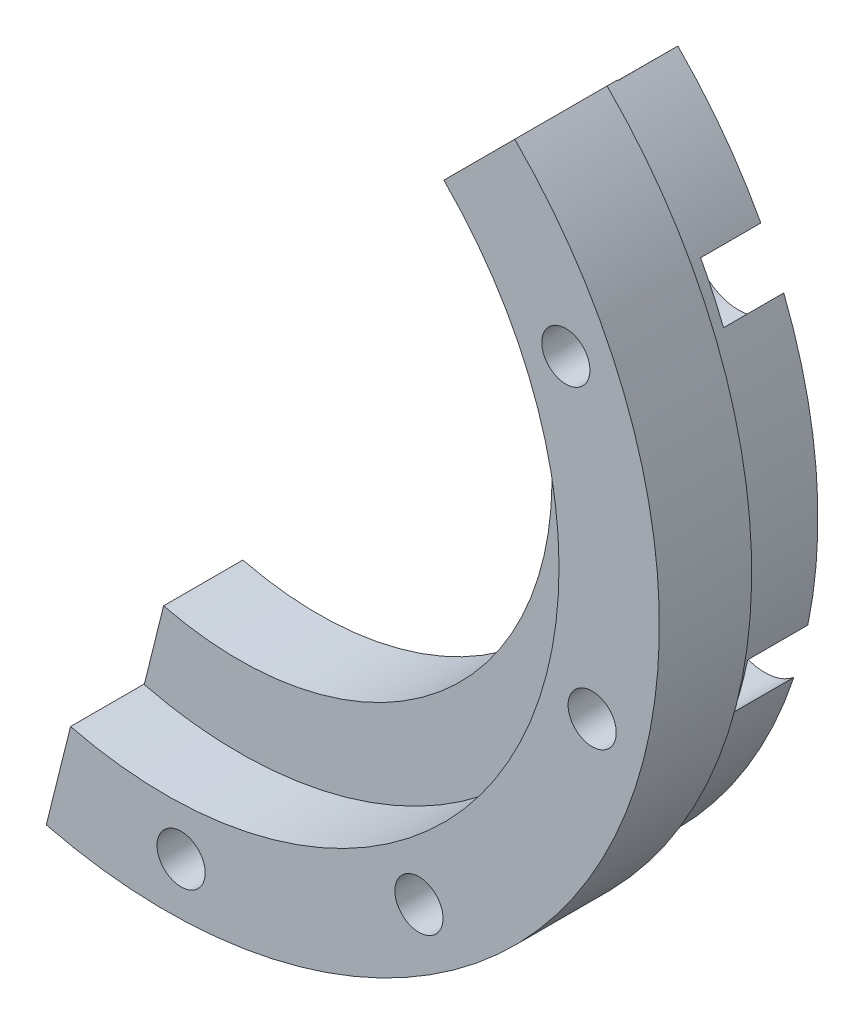
ISO-10303-21;
HEADER;
FILE_DESCRIPTION(('STEP AP214'),'2;1');
FILE_NAME('part.step','',(''),(''),'','','');
FILE_SCHEMA(('AUTOMOTIVE_DESIGN { 1 0 10303 214 1 1 1 1 }'));
ENDSEC;
DATA;
#1=APPLICATION_CONTEXT('core data for automotive mechanical design processes');
#2=APPLICATION_PROTOCOL_DEFINITION('international standard','automotive_design',2000,#1);
#3=PRODUCT_CONTEXT('',#1,'mechanical');
#4=PRODUCT('Part','Part','',(#3));
#5=PRODUCT_RELATED_PRODUCT_CATEGORY('part','',(#4));
#6=PRODUCT_DEFINITION_FORMATION('','',#4);
#7=PRODUCT_DEFINITION_CONTEXT('part definition',#1,'design');
#8=PRODUCT_DEFINITION('design','',#6,#7);
#9=PRODUCT_DEFINITION_SHAPE('','',#8);
#10=(LENGTH_UNIT() NAMED_UNIT(*) SI_UNIT(.MILLI.,.METRE.));
#11=(NAMED_UNIT(*) PLANE_ANGLE_UNIT() SI_UNIT($,.RADIAN.));
#12=(NAMED_UNIT(*) SI_UNIT($,.STERADIAN.) SOLID_ANGLE_UNIT());
#13=UNCERTAINTY_MEASURE_WITH_UNIT(LENGTH_MEASURE(1.E-05),#10,'distance_accuracy_value','');
#14=(GEOMETRIC_REPRESENTATION_CONTEXT(3) GLOBAL_UNCERTAINTY_ASSIGNED_CONTEXT((#13)) GLOBAL_UNIT_ASSIGNED_CONTEXT((#10,
#11,#12)) REPRESENTATION_CONTEXT('',''));
#15=CARTESIAN_POINT('',(0.,0.,0.));
#16=DIRECTION('',(0.,0.,1.));
#17=DIRECTION('',(1.,0.,0.));
#18=AXIS2_PLACEMENT_3D('',#15,#16,#17);
#19=CARTESIAN_POINT('',(0.,0.,26.55));
#20=DIRECTION('',(0.,0.,-1.));
#21=DIRECTION('',(-1.,0.,0.));
#22=AXIS2_PLACEMENT_3D('',#19,#20,#21);
#23=CYLINDRICAL_SURFACE('',#22,23.9);
#24=DIRECTION('',(0.,0.,-1.));
#25=VECTOR('',#24,1.);
#26=CARTESIAN_POINT('',(-0.51683150177486,-23.89441117079,23.05));
#27=LINE('',#26,#25);
#28=CARTESIAN_POINT('',(-0.516831501774837,-23.89441117079,24.6));
#29=VERTEX_POINT('',#28);
#30=CARTESIAN_POINT('',(-0.516831501774872,-23.89441117079,21.6));
#31=VERTEX_POINT('',#30);
#32=EDGE_CURVE('E53',#29,#31,#27,.T.);
#33=ORIENTED_EDGE('',*,*,#32,.F.);
#34=CARTESIAN_POINT('',(0.,0.,24.6));
#35=DIRECTION('',(0.,0.,1.));
#36=DIRECTION('',(1.,0.,0.));
#37=AXIS2_PLACEMENT_3D('',#34,#35,#36);
#38=CIRCLE('',#37,23.9);
#39=CARTESIAN_POINT('',(2.18236239167893,-23.8001532430231,24.6));
#40=VERTEX_POINT('',#39);
#41=EDGE_CURVE('E188',#29,#40,#38,.T.);
#42=ORIENTED_EDGE('',*,*,#41,.T.);
#43=DIRECTION('',(0.,0.,-1.));
#44=VECTOR('',#43,1.);
#45=CARTESIAN_POINT('',(2.18236239167895,-23.8001532430231,23.05));
#46=LINE('',#45,#44);
#47=CARTESIAN_POINT('',(2.18236239167896,-23.8001532430231,21.6));
#48=VERTEX_POINT('',#47);
#49=EDGE_CURVE('E194',#48,#40,#46,.F.);
#50=ORIENTED_EDGE('',*,*,#49,.F.);
#51=CARTESIAN_POINT('',(0.,0.,21.6));
#52=DIRECTION('',(0.,0.,1.));
#53=DIRECTION('',(-1.,0.,0.));
#54=AXIS2_PLACEMENT_3D('',#51,#52,#53);
#55=CIRCLE('',#54,23.9);
#56=CARTESIAN_POINT('',(12.5803776731857,-20.3210259977199,21.6));
#57=VERTEX_POINT('',#56);
#58=EDGE_CURVE('E62',#48,#57,#55,.T.);
#59=ORIENTED_EDGE('',*,*,#58,.T.);
#60=DIRECTION('',(0.,0.,-1.));
#61=VECTOR('',#60,1.);
#62=CARTESIAN_POINT('',(12.5803776731857,-20.3210259977199,23.05));
#63=LINE('',#62,#61);
#64=CARTESIAN_POINT('',(12.5803776731857,-20.3210259977199,24.6));
#65=VERTEX_POINT('',#64);
#66=EDGE_CURVE('E220',#65,#57,#63,.T.);
#67=ORIENTED_EDGE('',*,*,#66,.F.);
#68=CARTESIAN_POINT('',(0.,0.,24.6));
#69=DIRECTION('',(0.,0.,1.));
#70=DIRECTION('',(1.,0.,0.));
#71=AXIS2_PLACEMENT_3D('',#68,#69,#70);
#72=CIRCLE('',#71,23.9);
#73=CARTESIAN_POINT('',(14.792775601982,-18.7718882904573,24.6));
#74=VERTEX_POINT('',#73);
#75=EDGE_CURVE('E215',#65,#74,#72,.T.);
#76=ORIENTED_EDGE('',*,*,#75,.T.);
#77=DIRECTION('',(0.,0.,-1.));
#78=VECTOR('',#77,1.);
#79=CARTESIAN_POINT('',(14.792775601982,-18.7718882904572,23.05));
#80=LINE('',#79,#78);
#81=CARTESIAN_POINT('',(14.792775601982,-18.7718882904572,21.6));
#82=VERTEX_POINT('',#81);
#83=EDGE_CURVE('E213',#82,#74,#80,.F.);
#84=ORIENTED_EDGE('',*,*,#83,.F.);
#85=CARTESIAN_POINT('',(22.6992321363344,-7.4802981505287,21.6));
#86=VERTEX_POINT('',#85);
#87=EDGE_CURVE('E445',#82,#86,#55,.T.);
#88=ORIENTED_EDGE('',*,*,#87,.T.);
#89=DIRECTION('',(0.,0.,-1.));
#90=VECTOR('',#89,1.);
#91=CARTESIAN_POINT('',(22.6992321363344,-7.48029815052869,23.05));
#92=LINE('',#91,#90);
#93=CARTESIAN_POINT('',(22.6992321363344,-7.48029815052867,24.6));
#94=VERTEX_POINT('',#93);
#95=EDGE_CURVE('E233',#94,#86,#92,.T.);
#96=ORIENTED_EDGE('',*,*,#95,.F.);
#97=CARTESIAN_POINT('',(0.,0.,24.6));
#98=DIRECTION('',(0.,0.,1.));
#99=DIRECTION('',(1.,0.,0.));
#100=AXIS2_PLACEMENT_3D('',#97,#98,#99);
#101=CIRCLE('',#100,23.9);
#102=CARTESIAN_POINT('',(23.3982607517301,-4.87148784192762,24.6));
#103=VERTEX_POINT('',#102);
#104=EDGE_CURVE('E228',#94,#103,#101,.T.);
#105=ORIENTED_EDGE('',*,*,#104,.T.);
#106=DIRECTION('',(0.,0.,-1.));
#107=VECTOR('',#106,1.);
#108=CARTESIAN_POINT('',(23.39826075173,-4.8714878419276,23.05));
#109=LINE('',#108,#107);
#110=CARTESIAN_POINT('',(23.3982607517301,-4.8714878419276,21.6));
#111=VERTEX_POINT('',#110);
#112=EDGE_CURVE('E230',#111,#103,#109,.F.);
#113=ORIENTED_EDGE('',*,*,#112,.F.);
#114=CARTESIAN_POINT('',(22.1968636090277,8.86054433554859,21.6));
#115=VERTEX_POINT('',#114);
#116=EDGE_CURVE('E442',#111,#115,#55,.T.);
#117=ORIENTED_EDGE('',*,*,#116,.T.);
#118=DIRECTION('',(0.,0.,-1.));
#119=VECTOR('',#118,1.);
#120=CARTESIAN_POINT('',(22.1968636090277,8.86054433554859,23.05));
#121=LINE('',#120,#119);
#122=CARTESIAN_POINT('',(22.1968636090277,8.86054433554861,24.6));
#123=VERTEX_POINT('',#122);
#124=EDGE_CURVE('E246',#123,#115,#121,.T.);
#125=ORIENTED_EDGE('',*,*,#124,.F.);
#126=CARTESIAN_POINT('',(0.,0.,24.6));
#127=DIRECTION('',(0.,0.,1.));
#128=DIRECTION('',(1.,0.,0.));
#129=AXIS2_PLACEMENT_3D('',#126,#127,#128);
#130=CIRCLE('',#129,23.9);
#131=CARTESIAN_POINT('',(21.0554396530414,11.3083359083966,24.6));
#132=VERTEX_POINT('',#131);
#133=EDGE_CURVE('E241',#123,#132,#130,.T.);
#134=ORIENTED_EDGE('',*,*,#133,.T.);
#135=DIRECTION('',(0.,0.,-1.));
#136=VECTOR('',#135,1.);
#137=CARTESIAN_POINT('',(21.0554396530414,11.3083359083966,23.05));
#138=LINE('',#137,#136);
#139=CARTESIAN_POINT('',(21.0554396530414,11.3083359083966,21.6));
#140=VERTEX_POINT('',#139);
#141=EDGE_CURVE('E242',#140,#132,#138,.F.);
#142=ORIENTED_EDGE('',*,*,#141,.F.);
#143=CARTESIAN_POINT('',(16.9204865169707,16.8791923986016,21.6));
#144=VERTEX_POINT('',#143);
#145=EDGE_CURVE('E279',#140,#144,#55,.T.);
#146=ORIENTED_EDGE('',*,*,#145,.T.);
#147=DIRECTION('',(0.,0.,-1.));
#148=VECTOR('',#147,1.);
#149=CARTESIAN_POINT('',(16.9204865169707,16.8791923986016,26.55));
#150=LINE('',#149,#148);
#151=CARTESIAN_POINT('',(16.9204865169707,16.8791923986016,24.6));
#152=VERTEX_POINT('',#151);
#153=EDGE_CURVE('E297',#152,#144,#150,.T.);
#154=ORIENTED_EDGE('',*,*,#153,.F.);
#155=CARTESIAN_POINT('',(0.,0.,24.6));
#156=DIRECTION('',(0.,0.,-1.));
#157=DIRECTION('',(-1.,0.,0.));
#158=AXIS2_PLACEMENT_3D('',#155,#156,#157);
#159=CIRCLE('',#158,23.9);
#160=CARTESIAN_POINT('',(16.8998520703585,16.8998520703585,24.6));
#161=VERTEX_POINT('',#160);
#162=EDGE_CURVE('E272',#161,#152,#159,.T.);
#163=ORIENTED_EDGE('',*,*,#162,.F.);
#164=DIRECTION('',(0.,0.,-1.));
#165=VECTOR('',#164,1.);
#166=CARTESIAN_POINT('',(16.8998520703585,16.8998520703585,25.6));
#167=LINE('',#166,#165);
#168=CARTESIAN_POINT('',(16.8998520703585,16.8998520703585,25.6));
#169=VERTEX_POINT('',#168);
#170=EDGE_CURVE('E275',#161,#169,#167,.F.);
#171=ORIENTED_EDGE('',*,*,#170,.T.);
#172=CARTESIAN_POINT('',(0.,0.,25.6));
#173=DIRECTION('',(0.,0.,-1.));
#174=DIRECTION('',(1.,0.,0.));
#175=AXIS2_PLACEMENT_3D('',#172,#173,#174);
#176=CIRCLE('',#175,23.9);
#177=CARTESIAN_POINT('',(-5.78193330483206,-23.1900678579963,25.6));
#178=VERTEX_POINT('',#177);
#179=EDGE_CURVE('E263',#169,#178,#176,.T.);
#180=ORIENTED_EDGE('',*,*,#179,.T.);
#181=DIRECTION('',(0.,0.,-1.));
#182=VECTOR('',#181,1.);
#183=CARTESIAN_POINT('',(-5.78193330483206,-23.1900678579963,25.6));
#184=LINE('',#183,#182);
#185=CARTESIAN_POINT('',(-5.78193330483206,-23.1900678579963,24.6));
#186=VERTEX_POINT('',#185);
#187=EDGE_CURVE('E268',#178,#186,#184,.T.);
#188=ORIENTED_EDGE('',*,*,#187,.T.);
#189=CARTESIAN_POINT('',(-5.75359698409884,-23.1971145133305,24.6));
#190=VERTEX_POINT('',#189);
#191=EDGE_CURVE('E266',#190,#186,#159,.T.);
#192=ORIENTED_EDGE('',*,*,#191,.F.);
#193=DIRECTION('',(0.,0.,-1.));
#194=VECTOR('',#193,1.);
#195=CARTESIAN_POINT('',(-5.75359698409884,-23.1971145133305,26.55));
#196=LINE('',#195,#194);
#197=CARTESIAN_POINT('',(-5.75359698409884,-23.1971145133305,21.6));
#198=VERTEX_POINT('',#197);
#199=EDGE_CURVE('E290',#190,#198,#196,.T.);
#200=ORIENTED_EDGE('',*,*,#199,.T.);
#201=EDGE_CURVE('E203',#198,#31,#55,.T.);
#202=ORIENTED_EDGE('',*,*,#201,.T.);
#203=EDGE_LOOP('',(#33,#42,#50,#59,#67,#76,#84,#88,#96,#105,#113,#117,#125,#134,#142,#146,#154,
#163,#171,#180,#188,#192,#200,#202));
#204=FACE_BOUND('',#203,.T.);
#205=ADVANCED_FACE('F39',(#204),#23,.T.);
#206=CARTESIAN_POINT('',(11.044334295596,11.0173808124764,26.55));
#207=DIRECTION('',(0.706242359774127,-0.707970147153588,0.));
#208=DIRECTION('',(0.707970147153588,0.706242359774127,0.));
#209=AXIS2_PLACEMENT_3D('',#206,#207,#208);
#210=PLANE('',#209);
#211=DIRECTION('',(0.,0.,-1.));
#212=VECTOR('',#211,1.);
#213=CARTESIAN_POINT('',(12.035492501611,12.0061201161602,22.6));
#214=LINE('',#213,#212);
#215=CARTESIAN_POINT('',(12.035492501611,12.0061201161602,22.6));
#216=VERTEX_POINT('',#215);
#217=CARTESIAN_POINT('',(12.035492501611,12.0061201161602,21.6));
#218=VERTEX_POINT('',#217);
#219=EDGE_CURVE('E260',#216,#218,#214,.T.);
#220=ORIENTED_EDGE('',*,*,#219,.F.);
#221=DIRECTION('',(0.707970147153588,0.706242359774127,0.));
#222=VECTOR('',#221,1.);
#223=CARTESIAN_POINT('',(11.044334295596,11.0173808124764,22.6));
#224=LINE('',#223,#222);
#225=CARTESIAN_POINT('',(11.044334295596,11.0173808124764,22.6));
#226=VERTEX_POINT('',#225);
#227=EDGE_CURVE('E261',#226,#216,#224,.T.);
#228=ORIENTED_EDGE('',*,*,#227,.F.);
#229=DIRECTION('',(0.,0.,-1.));
#230=VECTOR('',#229,1.);
#231=CARTESIAN_POINT('',(11.044334295596,11.0173808124764,26.55));
#232=LINE('',#231,#230);
#233=CARTESIAN_POINT('',(11.044334295596,11.0173808124764,26.55));
#234=VERTEX_POINT('',#233);
#235=EDGE_CURVE('E300',#234,#226,#232,.T.);
#236=ORIENTED_EDGE('',*,*,#235,.F.);
#237=DIRECTION('',(-0.707970147153588,-0.706242359774127,0.));
#238=VECTOR('',#237,1.);
#239=CARTESIAN_POINT('',(11.044334295596,11.0173808124764,26.55));
#240=LINE('',#239,#238);
#241=CARTESIAN_POINT('',(13.8762148842103,13.8423502515729,26.55));
#242=VERTEX_POINT('',#241);
#243=EDGE_CURVE('E276',#242,#234,#240,.T.);
#244=ORIENTED_EDGE('',*,*,#243,.F.);
#245=DIRECTION('',(0.,0.,-1.));
#246=VECTOR('',#245,1.);
#247=CARTESIAN_POINT('',(13.8762148842103,13.8423502515729,30.2));
#248=LINE('',#247,#246);
#249=CARTESIAN_POINT('',(13.8762148842103,13.8423502515729,24.6));
#250=VERTEX_POINT('',#249);
#251=EDGE_CURVE('E304',#242,#250,#248,.T.);
#252=ORIENTED_EDGE('',*,*,#251,.T.);
#253=DIRECTION('',(-0.707970147153588,-0.706242359774127,0.));
#254=VECTOR('',#253,1.);
#255=CARTESIAN_POINT('',(0.,0.,24.6));
#256=LINE('',#255,#254);
#257=EDGE_CURVE('E338',#152,#250,#256,.T.);
#258=ORIENTED_EDGE('',*,*,#257,.F.);
#259=ORIENTED_EDGE('',*,*,#153,.T.);
#260=DIRECTION('',(-0.707970147153588,-0.706242359774127,0.));
#261=VECTOR('',#260,1.);
#262=CARTESIAN_POINT('',(11.044334295596,11.0173808124764,21.6));
#263=LINE('',#262,#261);
#264=EDGE_CURVE('E287',#144,#218,#263,.T.);
#265=ORIENTED_EDGE('',*,*,#264,.T.);
#266=EDGE_LOOP('',(#220,#228,#236,#244,#252,#258,#259,#265));
#267=FACE_BOUND('',#266,.T.);
#268=ADVANCED_FACE('F421',(#267),#210,.F.);
#269=CARTESIAN_POINT('',(-5.75359698409884,-23.1971145133305,26.55));
#270=DIRECTION('',(0.970590565411318,-0.240736275485307,0.));
#271=DIRECTION('',(0.240736275485307,0.970590565411318,0.));
#272=AXIS2_PLACEMENT_3D('',#269,#270,#271);
#273=PLANE('',#272);
#274=DIRECTION('',(0.,0.,-1.));
#275=VECTOR('',#274,1.);
#276=CARTESIAN_POINT('',(-4.09251668325022,-16.5000396119924,22.6));
#277=LINE('',#276,#275);
#278=CARTESIAN_POINT('',(-4.09251668325022,-16.5000396119924,21.6));
#279=VERTEX_POINT('',#278);
#280=CARTESIAN_POINT('',(-4.09251668325022,-16.5000396119924,22.6));
#281=VERTEX_POINT('',#280);
#282=EDGE_CURVE('E253',#279,#281,#277,.F.);
#283=ORIENTED_EDGE('',*,*,#282,.F.);
#284=DIRECTION('',(-0.240736275485307,-0.970590565411318,0.));
#285=VECTOR('',#284,1.);
#286=CARTESIAN_POINT('',(-5.75359698409884,-23.1971145133305,21.6));
#287=LINE('',#286,#285);
#288=EDGE_CURVE('E285',#279,#198,#287,.T.);
#289=ORIENTED_EDGE('',*,*,#288,.T.);
#290=ORIENTED_EDGE('',*,*,#199,.F.);
#291=DIRECTION('',(-0.240736275485307,-0.970590565411318,0.));
#292=VECTOR('',#291,1.);
#293=CARTESIAN_POINT('',(0.,0.,24.6));
#294=LINE('',#293,#292);
#295=CARTESIAN_POINT('',(-4.71843099951202,-19.0235750820618,24.6));
#296=VERTEX_POINT('',#295);
#297=EDGE_CURVE('E340',#296,#190,#294,.T.);
#298=ORIENTED_EDGE('',*,*,#297,.F.);
#299=DIRECTION('',(0.,0.,-1.));
#300=VECTOR('',#299,1.);
#301=CARTESIAN_POINT('',(-4.71843099951202,-19.0235750820618,30.2));
#302=LINE('',#301,#300);
#303=CARTESIAN_POINT('',(-4.71843099951202,-19.0235750820618,26.55));
#304=VERTEX_POINT('',#303);
#305=EDGE_CURVE('E303',#296,#304,#302,.F.);
#306=ORIENTED_EDGE('',*,*,#305,.T.);
#307=DIRECTION('',(-0.240736275485307,-0.970590565411318,0.));
#308=VECTOR('',#307,1.);
#309=CARTESIAN_POINT('',(-5.75359698409884,-23.1971145133305,26.55));
#310=LINE('',#309,#308);
#311=CARTESIAN_POINT('',(-3.7554858975708,-15.1412128204166,26.55));
#312=VERTEX_POINT('',#311);
#313=EDGE_CURVE('E282',#312,#304,#310,.T.);
#314=ORIENTED_EDGE('',*,*,#313,.F.);
#315=DIRECTION('',(0.,0.,-1.));
#316=VECTOR('',#315,1.);
#317=CARTESIAN_POINT('',(-3.7554858975708,-15.1412128204166,26.55));
#318=LINE('',#317,#316);
#319=CARTESIAN_POINT('',(-3.7554858975708,-15.1412128204166,22.6));
#320=VERTEX_POINT('',#319);
#321=EDGE_CURVE('E295',#312,#320,#318,.T.);
#322=ORIENTED_EDGE('',*,*,#321,.T.);
#323=DIRECTION('',(0.240736275485307,0.970590565411318,0.));
#324=VECTOR('',#323,1.);
#325=CARTESIAN_POINT('',(-5.75359698409884,-23.1971145133305,22.6));
#326=LINE('',#325,#324);
#327=EDGE_CURVE('E256',#281,#320,#326,.T.);
#328=ORIENTED_EDGE('',*,*,#327,.F.);
#329=EDGE_LOOP('',(#283,#289,#290,#298,#306,#314,#322,#328));
#330=FACE_BOUND('',#329,.T.);
#331=ADVANCED_FACE('F435',(#330),#273,.F.);
#332=CARTESIAN_POINT('',(0.,0.,26.55));
#333=DIRECTION('',(0.,0.,-1.));
#334=DIRECTION('',(-1.,0.,0.));
#335=AXIS2_PLACEMENT_3D('',#332,#333,#334);
#336=CYLINDRICAL_SURFACE('',#335,15.6);
#337=CARTESIAN_POINT('',(0.,0.,22.6));
#338=DIRECTION('',(0.,0.,-1.));
#339=DIRECTION('',(-1.,0.,0.));
#340=AXIS2_PLACEMENT_3D('',#337,#338,#339);
#341=CIRCLE('',#340,15.6);
#342=EDGE_CURVE('E349',#320,#226,#341,.F.);
#343=ORIENTED_EDGE('',*,*,#342,.F.);
#344=ORIENTED_EDGE('',*,*,#321,.F.);
#345=CARTESIAN_POINT('',(0.,0.,26.55));
#346=DIRECTION('',(0.,0.,-1.));
#347=DIRECTION('',(1.,0.,0.));
#348=AXIS2_PLACEMENT_3D('',#345,#346,#347);
#349=CIRCLE('',#348,15.6);
#350=EDGE_CURVE('E281',#234,#312,#349,.T.);
#351=ORIENTED_EDGE('',*,*,#350,.F.);
#352=ORIENTED_EDGE('',*,*,#235,.T.);
#353=EDGE_LOOP('',(#343,#344,#351,#352));
#354=FACE_BOUND('',#353,.T.);
#355=ADVANCED_FACE('F458',(#354),#336,.F.);
#356=CARTESIAN_POINT('',(0.,0.,24.6));
#357=DIRECTION('',(0.,0.,-1.));
#358=DIRECTION('',(-1.,0.,0.));
#359=AXIS2_PLACEMENT_3D('',#356,#357,#358);
#360=PLANE('',#359);
#361=DIRECTION('',(-0.707106781186547,-0.707106781186547,0.));
#362=VECTOR('',#361,1.);
#363=CARTESIAN_POINT('',(13.8592929112563,13.8592929112563,24.6));
#364=LINE('',#363,#362);
#365=CARTESIAN_POINT('',(13.8592929112563,13.8592929112563,24.6));
#366=VERTEX_POINT('',#365);
#367=EDGE_CURVE('E310',#161,#366,#364,.T.);
#368=ORIENTED_EDGE('',*,*,#367,.F.);
#369=ORIENTED_EDGE('',*,*,#162,.T.);
#370=ORIENTED_EDGE('',*,*,#257,.T.);
#371=CARTESIAN_POINT('',(0.,0.,24.6));
#372=DIRECTION('',(0.,0.,-1.));
#373=DIRECTION('',(1.,0.,0.));
#374=AXIS2_PLACEMENT_3D('',#371,#372,#373);
#375=CIRCLE('',#374,19.6);
#376=EDGE_CURVE('E322',#366,#250,#375,.T.);
#377=ORIENTED_EDGE('',*,*,#376,.F.);
#378=EDGE_LOOP('',(#368,#369,#370,#377));
#379=FACE_BOUND('',#378,.T.);
#380=ADVANCED_FACE('F420',(#379),#360,.T.);
#381=ORIENTED_EDGE('',*,*,#297,.T.);
#382=ORIENTED_EDGE('',*,*,#191,.T.);
#383=DIRECTION('',(-0.241921895599668,-0.970295726275996,0.));
#384=VECTOR('',#383,1.);
#385=CARTESIAN_POINT('',(-5.95127863175183,-23.8692748663895,24.6));
#386=LINE('',#385,#384);
#387=CARTESIAN_POINT('',(-4.74166915375349,-19.0177962350095,24.6));
#388=VERTEX_POINT('',#387);
#389=EDGE_CURVE('E315',#388,#186,#386,.T.);
#390=ORIENTED_EDGE('',*,*,#389,.F.);
#391=EDGE_CURVE('E318',#296,#388,#375,.T.);
#392=ORIENTED_EDGE('',*,*,#391,.F.);
#393=EDGE_LOOP('',(#381,#382,#390,#392));
#394=FACE_BOUND('',#393,.T.);
#395=ADVANCED_FACE('F436',(#394),#360,.T.);
#396=CARTESIAN_POINT('',(0.,0.,30.2));
#397=DIRECTION('',(0.,0.,-1.));
#398=DIRECTION('',(-1.,0.,0.));
#399=AXIS2_PLACEMENT_3D('',#396,#397,#398);
#400=CYLINDRICAL_SURFACE('',#399,24.6);
#401=CARTESIAN_POINT('',(0.,0.,25.6));
#402=DIRECTION('',(0.,0.,-1.));
#403=DIRECTION('',(-1.,0.,0.));
#404=AXIS2_PLACEMENT_3D('',#401,#402,#403);
#405=CIRCLE('',#404,24.6);
#406=CARTESIAN_POINT('',(17.3948268171891,17.3948268171891,25.6));
#407=VERTEX_POINT('',#406);
#408=CARTESIAN_POINT('',(-5.95127863175183,-23.8692748663895,25.6));
#409=VERTEX_POINT('',#408);
#410=EDGE_CURVE('E274',#407,#409,#405,.T.);
#411=ORIENTED_EDGE('',*,*,#410,.F.);
#412=DIRECTION('',(0.,0.,-1.));
#413=VECTOR('',#412,1.);
#414=CARTESIAN_POINT('',(17.3948268171891,17.3948268171891,30.2));
#415=LINE('',#414,#413);
#416=CARTESIAN_POINT('',(17.3948268171891,17.3948268171891,30.2));
#417=VERTEX_POINT('',#416);
#418=EDGE_CURVE('E332',#417,#407,#415,.T.);
#419=ORIENTED_EDGE('',*,*,#418,.F.);
#420=CARTESIAN_POINT('',(0.,0.,30.2));
#421=DIRECTION('',(0.,0.,1.));
#422=DIRECTION('',(-1.,0.,0.));
#423=AXIS2_PLACEMENT_3D('',#420,#421,#422);
#424=CIRCLE('',#423,24.6);
#425=CARTESIAN_POINT('',(-5.95127863175183,-23.8692748663895,30.2));
#426=VERTEX_POINT('',#425);
#427=EDGE_CURVE('E308',#426,#417,#424,.T.);
#428=ORIENTED_EDGE('',*,*,#427,.F.);
#429=DIRECTION('',(0.,0.,-1.));
#430=VECTOR('',#429,1.);
#431=CARTESIAN_POINT('',(-5.95127863175183,-23.8692748663895,30.2));
#432=LINE('',#431,#430);
#433=EDGE_CURVE('E319',#426,#409,#432,.T.);
#434=ORIENTED_EDGE('',*,*,#433,.T.);
#435=EDGE_LOOP('',(#411,#419,#428,#434));
#436=FACE_BOUND('',#435,.T.);
#437=ADVANCED_FACE('F41',(#436),#400,.T.);
#438=CARTESIAN_POINT('',(13.8592929112563,13.8592929112563,30.2));
#439=DIRECTION('',(0.707106781186548,-0.707106781186548,0.));
#440=DIRECTION('',(0.707106781186548,0.707106781186548,0.));
#441=AXIS2_PLACEMENT_3D('',#438,#439,#440);
#442=PLANE('',#441);
#443=ORIENTED_EDGE('',*,*,#170,.F.);
#444=ORIENTED_EDGE('',*,*,#367,.T.);
#445=DIRECTION('',(0.,0.,-1.));
#446=VECTOR('',#445,1.);
#447=CARTESIAN_POINT('',(13.8592929112563,13.8592929112563,30.2));
#448=LINE('',#447,#446);
#449=CARTESIAN_POINT('',(13.8592929112563,13.8592929112563,30.2));
#450=VERTEX_POINT('',#449);
#451=EDGE_CURVE('E333',#450,#366,#448,.T.);
#452=ORIENTED_EDGE('',*,*,#451,.F.);
#453=DIRECTION('',(-0.707106781186547,-0.707106781186547,0.));
#454=VECTOR('',#453,1.);
#455=CARTESIAN_POINT('',(13.8592929112563,13.8592929112563,30.2));
#456=LINE('',#455,#454);
#457=EDGE_CURVE('E311',#417,#450,#456,.T.);
#458=ORIENTED_EDGE('',*,*,#457,.F.);
#459=ORIENTED_EDGE('',*,*,#418,.T.);
#460=DIRECTION('',(0.707106781186548,0.707106781186548,0.));
#461=VECTOR('',#460,1.);
#462=CARTESIAN_POINT('',(13.8592929112563,13.8592929112563,25.6));
#463=LINE('',#462,#461);
#464=EDGE_CURVE('E277',#169,#407,#463,.T.);
#465=ORIENTED_EDGE('',*,*,#464,.F.);
#466=EDGE_LOOP('',(#443,#444,#452,#458,#459,#465));
#467=FACE_BOUND('',#466,.T.);
#468=ADVANCED_FACE('F396',(#467),#442,.F.);
#469=CARTESIAN_POINT('',(-5.95127863175183,-23.8692748663895,30.2));
#470=DIRECTION('',(0.970295726275996,-0.241921895599668,0.));
#471=DIRECTION('',(0.241921895599668,0.970295726275996,0.));
#472=AXIS2_PLACEMENT_3D('',#469,#470,#471);
#473=PLANE('',#472);
#474=ORIENTED_EDGE('',*,*,#187,.F.);
#475=DIRECTION('',(0.241921895599668,0.970295726275996,0.));
#476=VECTOR('',#475,1.);
#477=CARTESIAN_POINT('',(-5.95127863175183,-23.8692748663895,25.6));
#478=LINE('',#477,#476);
#479=EDGE_CURVE('E343',#409,#178,#478,.T.);
#480=ORIENTED_EDGE('',*,*,#479,.F.);
#481=ORIENTED_EDGE('',*,*,#433,.F.);
#482=DIRECTION('',(-0.241921895599668,-0.970295726275996,0.));
#483=VECTOR('',#482,1.);
#484=CARTESIAN_POINT('',(-5.95127863175183,-23.8692748663895,30.2));
#485=LINE('',#484,#483);
#486=CARTESIAN_POINT('',(-4.74166915375349,-19.0177962350095,30.2));
#487=VERTEX_POINT('',#486);
#488=EDGE_CURVE('E317',#487,#426,#485,.T.);
#489=ORIENTED_EDGE('',*,*,#488,.F.);
#490=DIRECTION('',(0.,0.,-1.));
#491=VECTOR('',#490,1.);
#492=CARTESIAN_POINT('',(-4.74166915375349,-19.0177962350095,30.2));
#493=LINE('',#492,#491);
#494=EDGE_CURVE('E328',#487,#388,#493,.T.);
#495=ORIENTED_EDGE('',*,*,#494,.T.);
#496=ORIENTED_EDGE('',*,*,#389,.T.);
#497=EDGE_LOOP('',(#474,#480,#481,#489,#495,#496));
#498=FACE_BOUND('',#497,.T.);
#499=ADVANCED_FACE('F408',(#498),#473,.F.);
#500=CARTESIAN_POINT('',(0.,0.,30.2));
#501=DIRECTION('',(0.,0.,-1.));
#502=DIRECTION('',(-1.,0.,0.));
#503=AXIS2_PLACEMENT_3D('',#500,#501,#502);
#504=CYLINDRICAL_SURFACE('',#503,19.6);
#505=ORIENTED_EDGE('',*,*,#251,.F.);
#506=CARTESIAN_POINT('',(0.,0.,26.55));
#507=DIRECTION('',(0.,0.,-1.));
#508=DIRECTION('',(-1.,0.,0.));
#509=AXIS2_PLACEMENT_3D('',#506,#507,#508);
#510=CIRCLE('',#509,19.6);
#511=EDGE_CURVE('E344',#304,#242,#510,.F.);
#512=ORIENTED_EDGE('',*,*,#511,.F.);
#513=ORIENTED_EDGE('',*,*,#305,.F.);
#514=ORIENTED_EDGE('',*,*,#391,.T.);
#515=ORIENTED_EDGE('',*,*,#494,.F.);
#516=CARTESIAN_POINT('',(0.,0.,30.2));
#517=DIRECTION('',(0.,0.,-1.));
#518=DIRECTION('',(1.,0.,0.));
#519=AXIS2_PLACEMENT_3D('',#516,#517,#518);
#520=CIRCLE('',#519,19.6);
#521=EDGE_CURVE('E313',#450,#487,#520,.T.);
#522=ORIENTED_EDGE('',*,*,#521,.F.);
#523=ORIENTED_EDGE('',*,*,#451,.T.);
#524=ORIENTED_EDGE('',*,*,#376,.T.);
#525=EDGE_LOOP('',(#505,#512,#513,#514,#515,#522,#523,#524));
#526=FACE_BOUND('',#525,.T.);
#527=ADVANCED_FACE('F379',(#526),#504,.F.);
#528=CARTESIAN_POINT('',(0.,0.,30.2));
#529=DIRECTION('',(0.,0.,-1.));
#530=DIRECTION('',(-1.,0.,0.));
#531=AXIS2_PLACEMENT_3D('',#528,#529,#530);
#532=PLANE('',#531);
#533=CARTESIAN_POINT('',(0.767788927455024,-21.9865981944201,30.2));
#534=DIRECTION('',(0.,0.,-1.));
#535=DIRECTION('',(-1.,0.,0.));
#536=AXIS2_PLACEMENT_3D('',#533,#534,#535);
#537=CIRCLE('',#536,1.2);
#538=CARTESIAN_POINT('',(-0.432211072544976,-21.9865981944201,30.2));
#539=VERTEX_POINT('',#538);
#540=EDGE_CURVE('E205',#539,#539,#537,.F.);
#541=ORIENTED_EDGE('',*,*,#540,.F.);
#542=EDGE_LOOP('',(#541));
#543=FACE_BOUND('',#542,.T.);
#544=CARTESIAN_POINT('',(12.618681599723,-18.0213449743578,30.2));
#545=DIRECTION('',(0.,0.,-1.));
#546=DIRECTION('',(-1.,0.,0.));
#547=AXIS2_PLACEMENT_3D('',#544,#545,#546);
#548=CIRCLE('',#547,1.2);
#549=CARTESIAN_POINT('',(11.418681599723,-18.0213449743578,30.2));
#550=VERTEX_POINT('',#549);
#551=EDGE_CURVE('E217',#550,#550,#548,.F.);
#552=ORIENTED_EDGE('',*,*,#551,.F.);
#553=EDGE_LOOP('',(#552));
#554=FACE_BOUND('',#553,.T.);
#555=CARTESIAN_POINT('',(21.2503681783595,-5.69401899225546,30.2));
#556=DIRECTION('',(0.,0.,-1.));
#557=DIRECTION('',(-1.,0.,0.));
#558=AXIS2_PLACEMENT_3D('',#555,#556,#557);
#559=CIRCLE('',#558,1.2);
#560=CARTESIAN_POINT('',(20.0503681783595,-5.69401899225546,30.2));
#561=VERTEX_POINT('',#560);
#562=EDGE_CURVE('E234',#561,#561,#559,.F.);
#563=ORIENTED_EDGE('',*,*,#562,.F.);
#564=EDGE_LOOP('',(#563));
#565=FACE_BOUND('',#564,.T.);
#566=CARTESIAN_POINT('',(19.9387713148063,9.29760175829539,30.2));
#567=DIRECTION('',(0.,0.,-1.));
#568=DIRECTION('',(-1.,0.,0.));
#569=AXIS2_PLACEMENT_3D('',#566,#567,#568);
#570=CIRCLE('',#569,1.2);
#571=CARTESIAN_POINT('',(18.7387713148063,9.29760175829539,30.2));
#572=VERTEX_POINT('',#571);
#573=EDGE_CURVE('E248',#572,#572,#570,.F.);
#574=ORIENTED_EDGE('',*,*,#573,.F.);
#575=EDGE_LOOP('',(#574));
#576=FACE_BOUND('',#575,.T.);
#577=ORIENTED_EDGE('',*,*,#427,.T.);
#578=ORIENTED_EDGE('',*,*,#457,.T.);
#579=ORIENTED_EDGE('',*,*,#521,.T.);
#580=ORIENTED_EDGE('',*,*,#488,.T.);
#581=EDGE_LOOP('',(#577,#578,#579,#580));
#582=FACE_BOUND('',#581,.T.);
#583=ADVANCED_FACE('F376',(#543,#554,#565,#576,#582),#532,.F.);
#584=CARTESIAN_POINT('',(0.,0.,26.55));
#585=DIRECTION('',(0.,0.,-1.));
#586=DIRECTION('',(-1.,0.,0.));
#587=AXIS2_PLACEMENT_3D('',#584,#585,#586);
#588=PLANE('',#587);
#589=ORIENTED_EDGE('',*,*,#313,.T.);
#590=ORIENTED_EDGE('',*,*,#511,.T.);
#591=ORIENTED_EDGE('',*,*,#243,.T.);
#592=ORIENTED_EDGE('',*,*,#350,.T.);
#593=EDGE_LOOP('',(#589,#590,#591,#592));
#594=FACE_BOUND('',#593,.T.);
#595=ADVANCED_FACE('F378',(#594),#588,.F.);
#596=CARTESIAN_POINT('',(0.,0.,21.6));
#597=DIRECTION('',(0.,0.,-1.));
#598=DIRECTION('',(-1.,0.,0.));
#599=AXIS2_PLACEMENT_3D('',#596,#597,#598);
#600=PLANE('',#599);
#601=ORIENTED_EDGE('',*,*,#58,.F.);
#602=CARTESIAN_POINT('',(0.767788927455024,-21.9865981944201,21.6));
#603=DIRECTION('',(0.,0.,-1.));
#604=DIRECTION('',(-1.,0.,0.));
#605=AXIS2_PLACEMENT_3D('',#602,#603,#604);
#606=CIRCLE('',#605,2.3);
#607=EDGE_CURVE('E11',#48,#31,#606,.F.);
#608=ORIENTED_EDGE('',*,*,#607,.T.);
#609=ORIENTED_EDGE('',*,*,#201,.F.);
#610=ORIENTED_EDGE('',*,*,#288,.F.);
#611=CARTESIAN_POINT('',(0.,0.,21.6));
#612=DIRECTION('',(0.,0.,-1.));
#613=DIRECTION('',(-1.,0.,0.));
#614=AXIS2_PLACEMENT_3D('',#611,#612,#613);
#615=CIRCLE('',#614,17.);
#616=EDGE_CURVE('E350',#279,#218,#615,.F.);
#617=ORIENTED_EDGE('',*,*,#616,.T.);
#618=ORIENTED_EDGE('',*,*,#264,.F.);
#619=ORIENTED_EDGE('',*,*,#145,.F.);
#620=CARTESIAN_POINT('',(19.9387713148063,9.29760175829539,21.6));
#621=DIRECTION('',(0.,0.,-1.));
#622=DIRECTION('',(-1.,0.,0.));
#623=AXIS2_PLACEMENT_3D('',#620,#621,#622);
#624=CIRCLE('',#623,2.3);
#625=EDGE_CURVE('E355',#140,#115,#624,.F.);
#626=ORIENTED_EDGE('',*,*,#625,.T.);
#627=ORIENTED_EDGE('',*,*,#116,.F.);
#628=CARTESIAN_POINT('',(21.2503681783595,-5.69401899225546,21.6));
#629=DIRECTION('',(0.,0.,-1.));
#630=DIRECTION('',(-1.,0.,0.));
#631=AXIS2_PLACEMENT_3D('',#628,#629,#630);
#632=CIRCLE('',#631,2.3);
#633=EDGE_CURVE('E357',#111,#86,#632,.F.);
#634=ORIENTED_EDGE('',*,*,#633,.T.);
#635=ORIENTED_EDGE('',*,*,#87,.F.);
#636=CARTESIAN_POINT('',(12.618681599723,-18.0213449743578,21.6));
#637=DIRECTION('',(0.,0.,-1.));
#638=DIRECTION('',(-1.,0.,0.));
#639=AXIS2_PLACEMENT_3D('',#636,#637,#638);
#640=CIRCLE('',#639,2.3);
#641=EDGE_CURVE('E50',#82,#57,#640,.F.);
#642=ORIENTED_EDGE('',*,*,#641,.T.);
#643=EDGE_LOOP('',(#601,#608,#609,#610,#617,#618,#619,#626,#627,#634,#635,#642));
#644=FACE_BOUND('',#643,.T.);
#645=ADVANCED_FACE('F437',(#644),#600,.T.);
#646=CARTESIAN_POINT('',(0.,0.,25.6));
#647=DIRECTION('',(0.,0.,-1.));
#648=DIRECTION('',(-1.,0.,0.));
#649=AXIS2_PLACEMENT_3D('',#646,#647,#648);
#650=PLANE('',#649);
#651=ORIENTED_EDGE('',*,*,#464,.T.);
#652=ORIENTED_EDGE('',*,*,#410,.T.);
#653=ORIENTED_EDGE('',*,*,#479,.T.);
#654=ORIENTED_EDGE('',*,*,#179,.F.);
#655=EDGE_LOOP('',(#651,#652,#653,#654));
#656=FACE_BOUND('',#655,.T.);
#657=ADVANCED_FACE('F412',(#656),#650,.T.);
#658=CARTESIAN_POINT('',(0.,0.,22.6));
#659=DIRECTION('',(0.,0.,-1.));
#660=DIRECTION('',(-1.,0.,0.));
#661=AXIS2_PLACEMENT_3D('',#658,#659,#660);
#662=PLANE('',#661);
#663=ORIENTED_EDGE('',*,*,#227,.T.);
#664=CARTESIAN_POINT('',(0.,0.,22.6));
#665=DIRECTION('',(0.,0.,1.));
#666=DIRECTION('',(-1.,0.,0.));
#667=AXIS2_PLACEMENT_3D('',#664,#665,#666);
#668=CIRCLE('',#667,17.);
#669=EDGE_CURVE('E255',#281,#216,#668,.T.);
#670=ORIENTED_EDGE('',*,*,#669,.F.);
#671=ORIENTED_EDGE('',*,*,#327,.T.);
#672=ORIENTED_EDGE('',*,*,#342,.T.);
#673=EDGE_LOOP('',(#663,#670,#671,#672));
#674=FACE_BOUND('',#673,.T.);
#675=ADVANCED_FACE('F453',(#674),#662,.T.);
#676=CARTESIAN_POINT('',(0.,0.,22.6));
#677=DIRECTION('',(0.,0.,-1.));
#678=DIRECTION('',(-1.,0.,0.));
#679=AXIS2_PLACEMENT_3D('',#676,#677,#678);
#680=CYLINDRICAL_SURFACE('',#679,17.);
#681=ORIENTED_EDGE('',*,*,#219,.T.);
#682=ORIENTED_EDGE('',*,*,#616,.F.);
#683=ORIENTED_EDGE('',*,*,#282,.T.);
#684=ORIENTED_EDGE('',*,*,#669,.T.);
#685=EDGE_LOOP('',(#681,#682,#683,#684));
#686=FACE_BOUND('',#685,.T.);
#687=ADVANCED_FACE('F455',(#686),#680,.F.);
#688=CARTESIAN_POINT('',(19.9387713148063,9.29760175829539,30.3));
#689=DIRECTION('',(0.,0.,-1.));
#690=DIRECTION('',(-1.,0.,0.));
#691=AXIS2_PLACEMENT_3D('',#688,#689,#690);
#692=CYLINDRICAL_SURFACE('',#691,1.2);
#693=CARTESIAN_POINT('',(19.9387713148063,9.29760175829539,24.6));
#694=DIRECTION('',(0.,0.,1.));
#695=DIRECTION('',(1.,0.,0.));
#696=AXIS2_PLACEMENT_3D('',#693,#694,#695);
#697=CIRCLE('',#696,1.2);
#698=CARTESIAN_POINT('',(21.1387713148063,9.29760175829539,24.6));
#699=VERTEX_POINT('',#698);
#700=EDGE_CURVE('E239',#699,#699,#697,.T.);
#701=ORIENTED_EDGE('',*,*,#700,.F.);
#702=EDGE_LOOP('',(#701));
#703=FACE_BOUND('',#702,.T.);
#704=ORIENTED_EDGE('',*,*,#573,.T.);
#705=EDGE_LOOP('',(#704));
#706=FACE_BOUND('',#705,.T.);
#707=ADVANCED_FACE('F567',(#703,#706),#692,.F.);
#708=CARTESIAN_POINT('',(19.9387713148063,9.29760175829539,24.6));
#709=DIRECTION('',(0.,0.,-1.));
#710=DIRECTION('',(-1.,0.,0.));
#711=AXIS2_PLACEMENT_3D('',#708,#709,#710);
#712=CYLINDRICAL_SURFACE('',#711,2.3);
#713=ORIENTED_EDGE('',*,*,#124,.T.);
#714=ORIENTED_EDGE('',*,*,#625,.F.);
#715=ORIENTED_EDGE('',*,*,#141,.T.);
#716=CARTESIAN_POINT('',(19.9387713148063,9.29760175829539,24.6));
#717=DIRECTION('',(0.,0.,1.));
#718=DIRECTION('',(1.,0.,0.));
#719=AXIS2_PLACEMENT_3D('',#716,#717,#718);
#720=CIRCLE('',#719,2.3);
#721=EDGE_CURVE('E240',#132,#123,#720,.T.);
#722=ORIENTED_EDGE('',*,*,#721,.T.);
#723=EDGE_LOOP('',(#713,#714,#715,#722));
#724=FACE_BOUND('',#723,.T.);
#725=ADVANCED_FACE('F580',(#724),#712,.F.);
#726=CARTESIAN_POINT('',(19.9387713148063,9.29760175829539,24.6));
#727=DIRECTION('',(0.,0.,1.));
#728=DIRECTION('',(1.,0.,0.));
#729=AXIS2_PLACEMENT_3D('',#726,#727,#728);
#730=PLANE('',#729);
#731=ORIENTED_EDGE('',*,*,#700,.T.);
#732=EDGE_LOOP('',(#731));
#733=FACE_BOUND('',#732,.T.);
#734=ORIENTED_EDGE('',*,*,#721,.F.);
#735=ORIENTED_EDGE('',*,*,#133,.F.);
#736=EDGE_LOOP('',(#734,#735));
#737=FACE_BOUND('',#736,.T.);
#738=ADVANCED_FACE('F586',(#733,#737),#730,.F.);
#739=CARTESIAN_POINT('',(21.2503681783595,-5.69401899225546,30.3));
#740=DIRECTION('',(0.,0.,-1.));
#741=DIRECTION('',(-1.,0.,0.));
#742=AXIS2_PLACEMENT_3D('',#739,#740,#741);
#743=CYLINDRICAL_SURFACE('',#742,1.2);
#744=CARTESIAN_POINT('',(21.2503681783595,-5.69401899225546,24.6));
#745=DIRECTION('',(0.,0.,1.));
#746=DIRECTION('',(1.,0.,0.));
#747=AXIS2_PLACEMENT_3D('',#744,#745,#746);
#748=CIRCLE('',#747,1.2);
#749=CARTESIAN_POINT('',(22.4503681783595,-5.69401899225546,24.6));
#750=VERTEX_POINT('',#749);
#751=EDGE_CURVE('E224',#750,#750,#748,.T.);
#752=ORIENTED_EDGE('',*,*,#751,.F.);
#753=EDGE_LOOP('',(#752));
#754=FACE_BOUND('',#753,.T.);
#755=ORIENTED_EDGE('',*,*,#562,.T.);
#756=EDGE_LOOP('',(#755));
#757=FACE_BOUND('',#756,.T.);
#758=ADVANCED_FACE('F594',(#754,#757),#743,.F.);
#759=CARTESIAN_POINT('',(21.2503681783595,-5.69401899225546,24.6));
#760=DIRECTION('',(0.,0.,-1.));
#761=DIRECTION('',(-1.,0.,0.));
#762=AXIS2_PLACEMENT_3D('',#759,#760,#761);
#763=CYLINDRICAL_SURFACE('',#762,2.3);
#764=ORIENTED_EDGE('',*,*,#95,.T.);
#765=ORIENTED_EDGE('',*,*,#633,.F.);
#766=ORIENTED_EDGE('',*,*,#112,.T.);
#767=CARTESIAN_POINT('',(21.2503681783595,-5.69401899225546,24.6));
#768=DIRECTION('',(0.,0.,1.));
#769=DIRECTION('',(1.,0.,0.));
#770=AXIS2_PLACEMENT_3D('',#767,#768,#769);
#771=CIRCLE('',#770,2.3);
#772=EDGE_CURVE('E225',#103,#94,#771,.T.);
#773=ORIENTED_EDGE('',*,*,#772,.T.);
#774=EDGE_LOOP('',(#764,#765,#766,#773));
#775=FACE_BOUND('',#774,.T.);
#776=ADVANCED_FACE('F601',(#775),#763,.F.);
#777=CARTESIAN_POINT('',(21.2503681783595,-5.69401899225546,24.6));
#778=DIRECTION('',(0.,0.,1.));
#779=DIRECTION('',(1.,0.,0.));
#780=AXIS2_PLACEMENT_3D('',#777,#778,#779);
#781=PLANE('',#780);
#782=ORIENTED_EDGE('',*,*,#751,.T.);
#783=EDGE_LOOP('',(#782));
#784=FACE_BOUND('',#783,.T.);
#785=ORIENTED_EDGE('',*,*,#772,.F.);
#786=ORIENTED_EDGE('',*,*,#104,.F.);
#787=EDGE_LOOP('',(#785,#786));
#788=FACE_BOUND('',#787,.T.);
#789=ADVANCED_FACE('F611',(#784,#788),#781,.F.);
#790=CARTESIAN_POINT('',(12.618681599723,-18.0213449743578,30.3));
#791=DIRECTION('',(0.,0.,-1.));
#792=DIRECTION('',(-1.,0.,0.));
#793=AXIS2_PLACEMENT_3D('',#790,#791,#792);
#794=CYLINDRICAL_SURFACE('',#793,1.2);
#795=CARTESIAN_POINT('',(12.618681599723,-18.0213449743578,24.6));
#796=DIRECTION('',(0.,0.,1.));
#797=DIRECTION('',(1.,0.,0.));
#798=AXIS2_PLACEMENT_3D('',#795,#796,#797);
#799=CIRCLE('',#798,1.2);
#800=CARTESIAN_POINT('',(13.818681599723,-18.0213449743578,24.6));
#801=VERTEX_POINT('',#800);
#802=EDGE_CURVE('E212',#801,#801,#799,.T.);
#803=ORIENTED_EDGE('',*,*,#802,.F.);
#804=EDGE_LOOP('',(#803));
#805=FACE_BOUND('',#804,.T.);
#806=ORIENTED_EDGE('',*,*,#551,.T.);
#807=EDGE_LOOP('',(#806));
#808=FACE_BOUND('',#807,.T.);
#809=ADVANCED_FACE('F625',(#805,#808),#794,.F.);
#810=CARTESIAN_POINT('',(12.618681599723,-18.0213449743578,24.6));
#811=DIRECTION('',(0.,0.,-1.));
#812=DIRECTION('',(-1.,0.,0.));
#813=AXIS2_PLACEMENT_3D('',#810,#811,#812);
#814=CYLINDRICAL_SURFACE('',#813,2.3);
#815=ORIENTED_EDGE('',*,*,#66,.T.);
#816=ORIENTED_EDGE('',*,*,#641,.F.);
#817=ORIENTED_EDGE('',*,*,#83,.T.);
#818=CARTESIAN_POINT('',(12.618681599723,-18.0213449743578,24.6));
#819=DIRECTION('',(0.,0.,1.));
#820=DIRECTION('',(1.,0.,0.));
#821=AXIS2_PLACEMENT_3D('',#818,#819,#820);
#822=CIRCLE('',#821,2.3);
#823=EDGE_CURVE('E204',#74,#65,#822,.T.);
#824=ORIENTED_EDGE('',*,*,#823,.T.);
#825=EDGE_LOOP('',(#815,#816,#817,#824));
#826=FACE_BOUND('',#825,.T.);
#827=ADVANCED_FACE('F631',(#826),#814,.F.);
#828=CARTESIAN_POINT('',(12.618681599723,-18.0213449743578,24.6));
#829=DIRECTION('',(0.,0.,1.));
#830=DIRECTION('',(1.,0.,0.));
#831=AXIS2_PLACEMENT_3D('',#828,#829,#830);
#832=PLANE('',#831);
#833=ORIENTED_EDGE('',*,*,#802,.T.);
#834=EDGE_LOOP('',(#833));
#835=FACE_BOUND('',#834,.T.);
#836=ORIENTED_EDGE('',*,*,#823,.F.);
#837=ORIENTED_EDGE('',*,*,#75,.F.);
#838=EDGE_LOOP('',(#836,#837));
#839=FACE_BOUND('',#838,.T.);
#840=ADVANCED_FACE('F375',(#835,#839),#832,.F.);
#841=CARTESIAN_POINT('',(0.767788927455024,-21.9865981944201,30.3));
#842=DIRECTION('',(0.,0.,-1.));
#843=DIRECTION('',(-1.,0.,0.));
#844=AXIS2_PLACEMENT_3D('',#841,#842,#843);
#845=CYLINDRICAL_SURFACE('',#844,1.2);
#846=CARTESIAN_POINT('',(0.767788927455024,-21.9865981944201,24.6));
#847=DIRECTION('',(0.,0.,1.));
#848=DIRECTION('',(1.,0.,0.));
#849=AXIS2_PLACEMENT_3D('',#846,#847,#848);
#850=CIRCLE('',#849,1.2);
#851=CARTESIAN_POINT('',(1.96778892745502,-21.9865981944201,24.6));
#852=VERTEX_POINT('',#851);
#853=EDGE_CURVE('E191',#852,#852,#850,.T.);
#854=ORIENTED_EDGE('',*,*,#853,.F.);
#855=EDGE_LOOP('',(#854));
#856=FACE_BOUND('',#855,.T.);
#857=ORIENTED_EDGE('',*,*,#540,.T.);
#858=EDGE_LOOP('',(#857));
#859=FACE_BOUND('',#858,.T.);
#860=ADVANCED_FACE('F367',(#856,#859),#845,.F.);
#861=CARTESIAN_POINT('',(0.767788927455024,-21.9865981944201,24.6));
#862=DIRECTION('',(0.,0.,-1.));
#863=DIRECTION('',(-1.,0.,0.));
#864=AXIS2_PLACEMENT_3D('',#861,#862,#863);
#865=CYLINDRICAL_SURFACE('',#864,2.3);
#866=ORIENTED_EDGE('',*,*,#32,.T.);
#867=ORIENTED_EDGE('',*,*,#607,.F.);
#868=ORIENTED_EDGE('',*,*,#49,.T.);
#869=CARTESIAN_POINT('',(0.767788927455024,-21.9865981944201,24.6));
#870=DIRECTION('',(0.,0.,1.));
#871=DIRECTION('',(1.,0.,0.));
#872=AXIS2_PLACEMENT_3D('',#869,#870,#871);
#873=CIRCLE('',#872,2.3);
#874=EDGE_CURVE('E195',#40,#29,#873,.T.);
#875=ORIENTED_EDGE('',*,*,#874,.T.);
#876=EDGE_LOOP('',(#866,#867,#868,#875));
#877=FACE_BOUND('',#876,.T.);
#878=ADVANCED_FACE('F196',(#877),#865,.F.);
#879=CARTESIAN_POINT('',(0.767788927455024,-21.9865981944201,24.6));
#880=DIRECTION('',(0.,0.,1.));
#881=DIRECTION('',(1.,0.,0.));
#882=AXIS2_PLACEMENT_3D('',#879,#880,#881);
#883=PLANE('',#882);
#884=ORIENTED_EDGE('',*,*,#853,.T.);
#885=EDGE_LOOP('',(#884));
#886=FACE_BOUND('',#885,.T.);
#887=ORIENTED_EDGE('',*,*,#874,.F.);
#888=ORIENTED_EDGE('',*,*,#41,.F.);
#889=EDGE_LOOP('',(#887,#888));
#890=FACE_BOUND('',#889,.T.);
#891=ADVANCED_FACE('F192',(#886,#890),#883,.F.);
#892=CLOSED_SHELL('',(#205,#268,#331,#355,#380,#395,#437,#468,#499,#527,#583,#595,#645,#657,
#675,#687,#707,#725,#738,#758,#776,#789,#809,#827,#840,#860,#878,#891));
#893=MANIFOLD_SOLID_BREP('B2',#892);
#894=ADVANCED_BREP_SHAPE_REPRESENTATION('',(#18,#893),#14);
#895=SHAPE_DEFINITION_REPRESENTATION(#9,#894);
ENDSEC;
END-ISO-10303-21;
